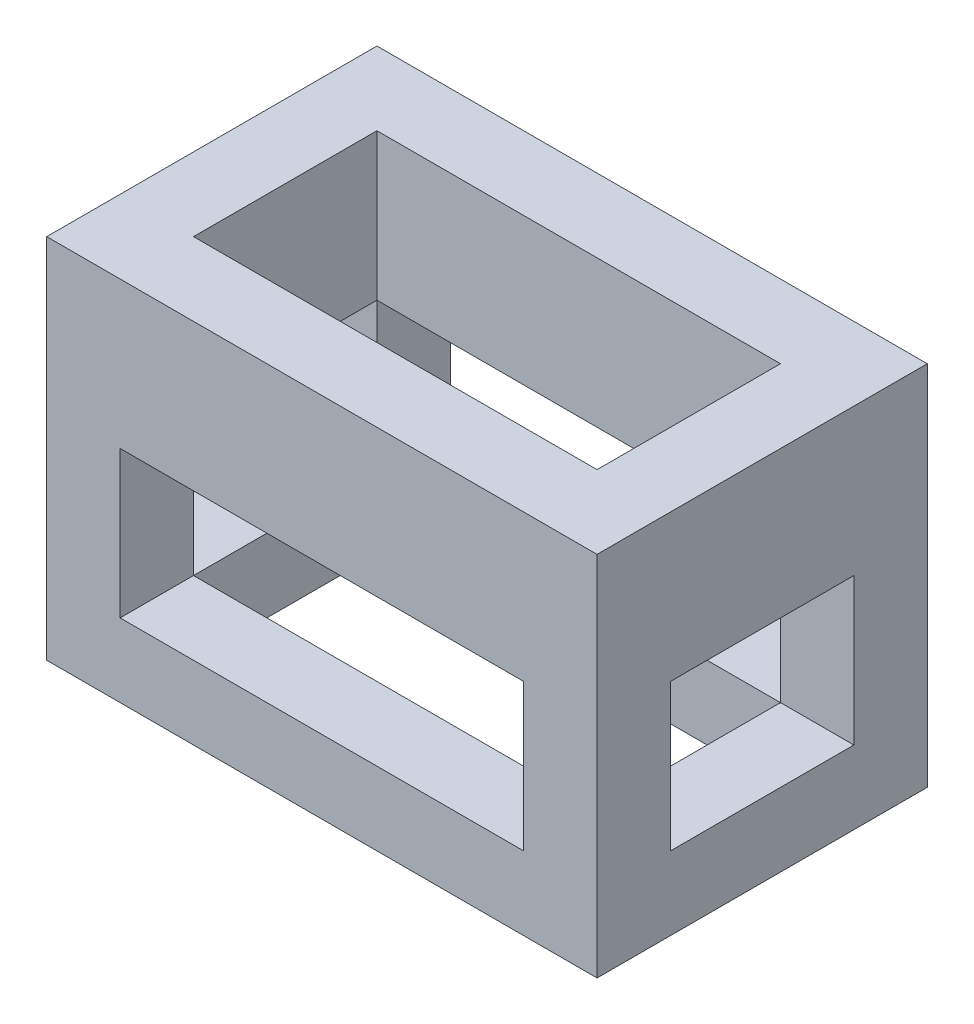
ISO-10303-21;
HEADER;
FILE_DESCRIPTION(('STEP AP214'),'2;1');
FILE_NAME('part.step','',(''),(''),'','','');
FILE_SCHEMA(('AUTOMOTIVE_DESIGN { 1 0 10303 214 1 1 1 1 }'));
ENDSEC;
DATA;
#1=APPLICATION_CONTEXT('core data for automotive mechanical design processes');
#2=APPLICATION_PROTOCOL_DEFINITION('international standard','automotive_design',2000,#1);
#3=PRODUCT_CONTEXT('',#1,'mechanical');
#4=PRODUCT('Part','Part','',(#3));
#5=PRODUCT_RELATED_PRODUCT_CATEGORY('part','',(#4));
#6=PRODUCT_DEFINITION_FORMATION('','',#4);
#7=PRODUCT_DEFINITION_CONTEXT('part definition',#1,'design');
#8=PRODUCT_DEFINITION('design','',#6,#7);
#9=PRODUCT_DEFINITION_SHAPE('','',#8);
#10=(LENGTH_UNIT() NAMED_UNIT(*) SI_UNIT(.MILLI.,.METRE.));
#11=(NAMED_UNIT(*) PLANE_ANGLE_UNIT() SI_UNIT($,.RADIAN.));
#12=(NAMED_UNIT(*) SI_UNIT($,.STERADIAN.) SOLID_ANGLE_UNIT());
#13=UNCERTAINTY_MEASURE_WITH_UNIT(LENGTH_MEASURE(1.E-05),#10,'distance_accuracy_value','');
#14=(GEOMETRIC_REPRESENTATION_CONTEXT(3) GLOBAL_UNCERTAINTY_ASSIGNED_CONTEXT((#13)) GLOBAL_UNIT_ASSIGNED_CONTEXT((#10,
#11,#12)) REPRESENTATION_CONTEXT('',''));
#15=CARTESIAN_POINT('',(0.,0.,0.));
#16=DIRECTION('',(0.,0.,1.));
#17=DIRECTION('',(1.,0.,0.));
#18=AXIS2_PLACEMENT_3D('',#15,#16,#17);
#19=CARTESIAN_POINT('',(69.85,76.2,-57.15));
#20=DIRECTION('',(0.,1.,0.));
#21=DIRECTION('',(-1.,0.,0.));
#22=AXIS2_PLACEMENT_3D('',#19,#20,#21);
#23=PLANE('',#22);
#24=DIRECTION('',(1.,0.,0.));
#25=VECTOR('',#24,1.);
#26=CARTESIAN_POINT('',(-95.25,76.2,-31.75));
#27=LINE('',#26,#25);
#28=CARTESIAN_POINT('',(-95.25,76.2,-31.75));
#29=VERTEX_POINT('',#28);
#30=CARTESIAN_POINT('',(-69.85,76.2,-31.75));
#31=VERTEX_POINT('',#30);
#32=EDGE_CURVE('E265',#29,#31,#27,.T.);
#33=ORIENTED_EDGE('',*,*,#32,.T.);
#34=DIRECTION('',(0.,0.,1.));
#35=VECTOR('',#34,1.);
#36=CARTESIAN_POINT('',(-69.85,76.2,-57.15));
#37=LINE('',#36,#35);
#38=CARTESIAN_POINT('',(-69.85,76.2,31.75));
#39=VERTEX_POINT('',#38);
#40=EDGE_CURVE('E221',#31,#39,#37,.T.);
#41=ORIENTED_EDGE('',*,*,#40,.T.);
#42=DIRECTION('',(1.,0.,0.));
#43=VECTOR('',#42,1.);
#44=CARTESIAN_POINT('',(-95.25,76.2,31.75));
#45=LINE('',#44,#43);
#46=CARTESIAN_POINT('',(-95.25,76.2,31.75));
#47=VERTEX_POINT('',#46);
#48=EDGE_CURVE('E260',#47,#39,#45,.T.);
#49=ORIENTED_EDGE('',*,*,#48,.F.);
#50=DIRECTION('',(0.,0.,1.));
#51=VECTOR('',#50,1.);
#52=CARTESIAN_POINT('',(-95.25,76.2,-31.75));
#53=LINE('',#52,#51);
#54=EDGE_CURVE('E247',#29,#47,#53,.T.);
#55=ORIENTED_EDGE('',*,*,#54,.F.);
#56=EDGE_LOOP('',(#33,#41,#49,#55));
#57=FACE_BOUND('',#56,.T.);
#58=ADVANCED_FACE('F35',(#57),#23,.F.);
#59=DIRECTION('',(0.,0.,1.));
#60=VECTOR('',#59,1.);
#61=CARTESIAN_POINT('',(69.85,76.2,-57.15));
#62=LINE('',#61,#60);
#63=CARTESIAN_POINT('',(69.85,76.2,-57.15));
#64=VERTEX_POINT('',#63);
#65=CARTESIAN_POINT('',(69.85,76.2,-31.75));
#66=VERTEX_POINT('',#65);
#67=EDGE_CURVE('E317',#64,#66,#62,.T.);
#68=ORIENTED_EDGE('',*,*,#67,.T.);
#69=DIRECTION('',(-1.,0.,0.));
#70=VECTOR('',#69,1.);
#71=CARTESIAN_POINT('',(69.85,76.2,-31.75));
#72=LINE('',#71,#70);
#73=EDGE_CURVE('E233',#66,#31,#72,.T.);
#74=ORIENTED_EDGE('',*,*,#73,.T.);
#75=DIRECTION('',(0.,0.,1.));
#76=VECTOR('',#75,1.);
#77=CARTESIAN_POINT('',(-69.85,76.2,-57.15));
#78=LINE('',#77,#76);
#79=CARTESIAN_POINT('',(-69.85,76.2,-57.15));
#80=VERTEX_POINT('',#79);
#81=EDGE_CURVE('E312',#80,#31,#78,.T.);
#82=ORIENTED_EDGE('',*,*,#81,.F.);
#83=DIRECTION('',(-1.,0.,0.));
#84=VECTOR('',#83,1.);
#85=CARTESIAN_POINT('',(69.85,76.2,-57.15));
#86=LINE('',#85,#84);
#87=EDGE_CURVE('E298',#64,#80,#86,.T.);
#88=ORIENTED_EDGE('',*,*,#87,.F.);
#89=EDGE_LOOP('',(#68,#74,#82,#88));
#90=FACE_BOUND('',#89,.T.);
#91=ADVANCED_FACE('F441',(#90),#23,.F.);
#92=CARTESIAN_POINT('',(69.85,76.2,31.75));
#93=VERTEX_POINT('',#92);
#94=CARTESIAN_POINT('',(95.25,76.2,31.75));
#95=VERTEX_POINT('',#94);
#96=EDGE_CURVE('E264',#93,#95,#45,.T.);
#97=ORIENTED_EDGE('',*,*,#96,.F.);
#98=DIRECTION('',(0.,0.,-1.));
#99=VECTOR('',#98,1.);
#100=CARTESIAN_POINT('',(69.85,76.2,-57.15));
#101=LINE('',#100,#99);
#102=EDGE_CURVE('E227',#93,#66,#101,.T.);
#103=ORIENTED_EDGE('',*,*,#102,.T.);
#104=CARTESIAN_POINT('',(95.25,76.2,-31.75));
#105=VERTEX_POINT('',#104);
#106=EDGE_CURVE('E268',#66,#105,#27,.T.);
#107=ORIENTED_EDGE('',*,*,#106,.T.);
#108=DIRECTION('',(0.,0.,1.));
#109=VECTOR('',#108,1.);
#110=CARTESIAN_POINT('',(95.25,76.2,-31.75));
#111=LINE('',#110,#109);
#112=EDGE_CURVE('E241',#105,#95,#111,.T.);
#113=ORIENTED_EDGE('',*,*,#112,.T.);
#114=EDGE_LOOP('',(#97,#103,#107,#113));
#115=FACE_BOUND('',#114,.T.);
#116=ADVANCED_FACE('F388',(#115),#23,.F.);
#117=CARTESIAN_POINT('',(69.85,25.4,-57.15));
#118=DIRECTION('',(0.,-1.,0.));
#119=DIRECTION('',(1.,0.,0.));
#120=AXIS2_PLACEMENT_3D('',#117,#118,#119);
#121=PLANE('',#120);
#122=DIRECTION('',(1.,0.,0.));
#123=VECTOR('',#122,1.);
#124=CARTESIAN_POINT('',(-95.25,25.4,31.75));
#125=LINE('',#124,#123);
#126=CARTESIAN_POINT('',(-95.25,25.4,31.75));
#127=VERTEX_POINT('',#126);
#128=CARTESIAN_POINT('',(-69.85,25.4,31.75));
#129=VERTEX_POINT('',#128);
#130=EDGE_CURVE('E273',#127,#129,#125,.T.);
#131=ORIENTED_EDGE('',*,*,#130,.T.);
#132=DIRECTION('',(0.,0.,-1.));
#133=VECTOR('',#132,1.);
#134=CARTESIAN_POINT('',(-69.85,25.4,-57.15));
#135=LINE('',#134,#133);
#136=CARTESIAN_POINT('',(-69.85,25.4,-31.75));
#137=VERTEX_POINT('',#136);
#138=EDGE_CURVE('E182',#129,#137,#135,.T.);
#139=ORIENTED_EDGE('',*,*,#138,.T.);
#140=DIRECTION('',(1.,0.,0.));
#141=VECTOR('',#140,1.);
#142=CARTESIAN_POINT('',(-95.25,25.4,-31.75));
#143=LINE('',#142,#141);
#144=CARTESIAN_POINT('',(-95.25,25.4,-31.75));
#145=VERTEX_POINT('',#144);
#146=EDGE_CURVE('E269',#145,#137,#143,.T.);
#147=ORIENTED_EDGE('',*,*,#146,.F.);
#148=DIRECTION('',(0.,0.,-1.));
#149=VECTOR('',#148,1.);
#150=CARTESIAN_POINT('',(-95.25,25.4,-31.75));
#151=LINE('',#150,#149);
#152=EDGE_CURVE('E240',#127,#145,#151,.T.);
#153=ORIENTED_EDGE('',*,*,#152,.F.);
#154=EDGE_LOOP('',(#131,#139,#147,#153));
#155=FACE_BOUND('',#154,.T.);
#156=ADVANCED_FACE('F363',(#155),#121,.F.);
#157=DIRECTION('',(0.,0.,1.));
#158=VECTOR('',#157,1.);
#159=CARTESIAN_POINT('',(-69.85,25.4,-57.15));
#160=LINE('',#159,#158);
#161=CARTESIAN_POINT('',(-69.85,25.4,-57.15));
#162=VERTEX_POINT('',#161);
#163=EDGE_CURVE('E325',#162,#137,#160,.T.);
#164=ORIENTED_EDGE('',*,*,#163,.T.);
#165=DIRECTION('',(1.,0.,0.));
#166=VECTOR('',#165,1.);
#167=CARTESIAN_POINT('',(69.85,25.4,-31.75));
#168=LINE('',#167,#166);
#169=CARTESIAN_POINT('',(69.85,25.4,-31.75));
#170=VERTEX_POINT('',#169);
#171=EDGE_CURVE('E11',#137,#170,#168,.T.);
#172=ORIENTED_EDGE('',*,*,#171,.T.);
#173=DIRECTION('',(0.,0.,1.));
#174=VECTOR('',#173,1.);
#175=CARTESIAN_POINT('',(69.85,25.4,-57.15));
#176=LINE('',#175,#174);
#177=CARTESIAN_POINT('',(69.85,25.4,-57.15));
#178=VERTEX_POINT('',#177);
#179=EDGE_CURVE('E321',#178,#170,#176,.T.);
#180=ORIENTED_EDGE('',*,*,#179,.F.);
#181=DIRECTION('',(1.,0.,0.));
#182=VECTOR('',#181,1.);
#183=CARTESIAN_POINT('',(69.85,25.4,-57.15));
#184=LINE('',#183,#182);
#185=EDGE_CURVE('E291',#162,#178,#184,.T.);
#186=ORIENTED_EDGE('',*,*,#185,.F.);
#187=EDGE_LOOP('',(#164,#172,#180,#186));
#188=FACE_BOUND('',#187,.T.);
#189=ADVANCED_FACE('F406',(#188),#121,.F.);
#190=CARTESIAN_POINT('',(95.25,25.4,-31.75));
#191=VERTEX_POINT('',#190);
#192=EDGE_CURVE('E272',#170,#191,#143,.T.);
#193=ORIENTED_EDGE('',*,*,#192,.F.);
#194=DIRECTION('',(0.,0.,1.));
#195=VECTOR('',#194,1.);
#196=CARTESIAN_POINT('',(69.85,25.4,-57.15));
#197=LINE('',#196,#195);
#198=CARTESIAN_POINT('',(69.85,25.4,31.75));
#199=VERTEX_POINT('',#198);
#200=EDGE_CURVE('E224',#170,#199,#197,.T.);
#201=ORIENTED_EDGE('',*,*,#200,.T.);
#202=CARTESIAN_POINT('',(95.25,25.4,31.75));
#203=VERTEX_POINT('',#202);
#204=EDGE_CURVE('E250',#199,#203,#125,.T.);
#205=ORIENTED_EDGE('',*,*,#204,.T.);
#206=DIRECTION('',(0.,0.,-1.));
#207=VECTOR('',#206,1.);
#208=CARTESIAN_POINT('',(95.25,25.4,-31.75));
#209=LINE('',#208,#207);
#210=EDGE_CURVE('E252',#203,#191,#209,.T.);
#211=ORIENTED_EDGE('',*,*,#210,.T.);
#212=EDGE_LOOP('',(#193,#201,#205,#211));
#213=FACE_BOUND('',#212,.T.);
#214=ADVANCED_FACE('F399',(#213),#121,.F.);
#215=CARTESIAN_POINT('',(-69.85,25.4,-57.15));
#216=DIRECTION('',(-1.,0.,0.));
#217=DIRECTION('',(0.,0.,1.));
#218=AXIS2_PLACEMENT_3D('',#215,#216,#217);
#219=PLANE('',#218);
#220=CARTESIAN_POINT('',(-69.85,25.4,57.15));
#221=VERTEX_POINT('',#220);
#222=EDGE_CURVE('E301',#129,#221,#160,.T.);
#223=ORIENTED_EDGE('',*,*,#222,.F.);
#224=DIRECTION('',(0.,1.,0.));
#225=VECTOR('',#224,1.);
#226=CARTESIAN_POINT('',(-69.85,25.4,31.75));
#227=LINE('',#226,#225);
#228=EDGE_CURVE('E284',#129,#39,#227,.T.);
#229=ORIENTED_EDGE('',*,*,#228,.T.);
#230=CARTESIAN_POINT('',(-69.85,76.2,57.15));
#231=VERTEX_POINT('',#230);
#232=EDGE_CURVE('E316',#39,#231,#78,.T.);
#233=ORIENTED_EDGE('',*,*,#232,.T.);
#234=DIRECTION('',(0.,-1.,0.));
#235=VECTOR('',#234,1.);
#236=CARTESIAN_POINT('',(-69.85,25.4,57.15));
#237=LINE('',#236,#235);
#238=EDGE_CURVE('E287',#231,#221,#237,.T.);
#239=ORIENTED_EDGE('',*,*,#238,.T.);
#240=EDGE_LOOP('',(#223,#229,#233,#239));
#241=FACE_BOUND('',#240,.T.);
#242=ADVANCED_FACE('F370',(#241),#219,.F.);
#243=CARTESIAN_POINT('',(69.85,25.4,-57.15));
#244=DIRECTION('',(1.,0.,0.));
#245=DIRECTION('',(0.,0.,-1.));
#246=AXIS2_PLACEMENT_3D('',#243,#244,#245);
#247=PLANE('',#246);
#248=CARTESIAN_POINT('',(69.85,76.2,57.15));
#249=VERTEX_POINT('',#248);
#250=EDGE_CURVE('E320',#93,#249,#62,.T.);
#251=ORIENTED_EDGE('',*,*,#250,.F.);
#252=DIRECTION('',(0.,-1.,0.));
#253=VECTOR('',#252,1.);
#254=CARTESIAN_POINT('',(69.85,25.4,31.75));
#255=LINE('',#254,#253);
#256=EDGE_CURVE('E281',#93,#199,#255,.T.);
#257=ORIENTED_EDGE('',*,*,#256,.T.);
#258=CARTESIAN_POINT('',(69.85,25.4,57.15));
#259=VERTEX_POINT('',#258);
#260=EDGE_CURVE('E324',#199,#259,#176,.T.);
#261=ORIENTED_EDGE('',*,*,#260,.T.);
#262=DIRECTION('',(0.,1.,0.));
#263=VECTOR('',#262,1.);
#264=CARTESIAN_POINT('',(69.85,25.4,57.15));
#265=LINE('',#264,#263);
#266=EDGE_CURVE('E307',#259,#249,#265,.T.);
#267=ORIENTED_EDGE('',*,*,#266,.T.);
#268=EDGE_LOOP('',(#251,#257,#261,#267));
#269=FACE_BOUND('',#268,.T.);
#270=ADVANCED_FACE('F380',(#269),#247,.F.);
#271=CARTESIAN_POINT('',(95.25,127.,57.15));
#272=DIRECTION('',(-1.,0.,0.));
#273=DIRECTION('',(0.,0.,1.));
#274=AXIS2_PLACEMENT_3D('',#271,#272,#273);
#275=PLANE('',#274);
#276=ORIENTED_EDGE('',*,*,#210,.F.);
#277=DIRECTION('',(0.,-1.,0.));
#278=VECTOR('',#277,1.);
#279=CARTESIAN_POINT('',(95.25,25.4,31.75));
#280=LINE('',#279,#278);
#281=EDGE_CURVE('E236',#95,#203,#280,.T.);
#282=ORIENTED_EDGE('',*,*,#281,.F.);
#283=ORIENTED_EDGE('',*,*,#112,.F.);
#284=DIRECTION('',(0.,1.,0.));
#285=VECTOR('',#284,1.);
#286=CARTESIAN_POINT('',(95.25,25.4,-31.75));
#287=LINE('',#286,#285);
#288=EDGE_CURVE('E255',#191,#105,#287,.T.);
#289=ORIENTED_EDGE('',*,*,#288,.F.);
#290=EDGE_LOOP('',(#276,#282,#283,#289));
#291=FACE_BOUND('',#290,.T.);
#292=DIRECTION('',(0.,0.,-1.));
#293=VECTOR('',#292,1.);
#294=CARTESIAN_POINT('',(95.25,0.,57.15));
#295=LINE('',#294,#293);
#296=CARTESIAN_POINT('',(95.25,0.,57.15));
#297=VERTEX_POINT('',#296);
#298=CARTESIAN_POINT('',(95.25,0.,-57.15));
#299=VERTEX_POINT('',#298);
#300=EDGE_CURVE('E315',#297,#299,#295,.T.);
#301=ORIENTED_EDGE('',*,*,#300,.T.);
#302=DIRECTION('',(0.,-1.,0.));
#303=VECTOR('',#302,1.);
#304=CARTESIAN_POINT('',(95.25,127.,-57.15));
#305=LINE('',#304,#303);
#306=CARTESIAN_POINT('',(95.25,127.,-57.15));
#307=VERTEX_POINT('',#306);
#308=EDGE_CURVE('E354',#307,#299,#305,.T.);
#309=ORIENTED_EDGE('',*,*,#308,.F.);
#310=DIRECTION('',(0.,0.,-1.));
#311=VECTOR('',#310,1.);
#312=CARTESIAN_POINT('',(95.25,127.,57.15));
#313=LINE('',#312,#311);
#314=CARTESIAN_POINT('',(95.25,127.,57.15));
#315=VERTEX_POINT('',#314);
#316=EDGE_CURVE('E328',#315,#307,#313,.T.);
#317=ORIENTED_EDGE('',*,*,#316,.F.);
#318=DIRECTION('',(0.,-1.,0.));
#319=VECTOR('',#318,1.);
#320=CARTESIAN_POINT('',(95.25,127.,57.15));
#321=LINE('',#320,#319);
#322=EDGE_CURVE('E338',#315,#297,#321,.T.);
#323=ORIENTED_EDGE('',*,*,#322,.T.);
#324=EDGE_LOOP('',(#301,#309,#317,#323));
#325=FACE_BOUND('',#324,.T.);
#326=ADVANCED_FACE('F37',(#291,#325),#275,.F.);
#327=CARTESIAN_POINT('',(-95.25,127.,-57.15));
#328=DIRECTION('',(0.,0.,1.));
#329=DIRECTION('',(1.,0.,0.));
#330=AXIS2_PLACEMENT_3D('',#327,#328,#329);
#331=PLANE('',#330);
#332=ORIENTED_EDGE('',*,*,#87,.T.);
#333=DIRECTION('',(0.,-1.,0.));
#334=VECTOR('',#333,1.);
#335=CARTESIAN_POINT('',(-69.85,25.4,-57.15));
#336=LINE('',#335,#334);
#337=EDGE_CURVE('E288',#80,#162,#336,.T.);
#338=ORIENTED_EDGE('',*,*,#337,.T.);
#339=ORIENTED_EDGE('',*,*,#185,.T.);
#340=DIRECTION('',(0.,1.,0.));
#341=VECTOR('',#340,1.);
#342=CARTESIAN_POINT('',(69.85,25.4,-57.15));
#343=LINE('',#342,#341);
#344=EDGE_CURVE('E295',#178,#64,#343,.T.);
#345=ORIENTED_EDGE('',*,*,#344,.T.);
#346=EDGE_LOOP('',(#332,#338,#339,#345));
#347=FACE_BOUND('',#346,.T.);
#348=DIRECTION('',(-1.,0.,0.));
#349=VECTOR('',#348,1.);
#350=CARTESIAN_POINT('',(-95.25,0.,-57.15));
#351=LINE('',#350,#349);
#352=CARTESIAN_POINT('',(-95.25,0.,-57.15));
#353=VERTEX_POINT('',#352);
#354=EDGE_CURVE('E341',#299,#353,#351,.T.);
#355=ORIENTED_EDGE('',*,*,#354,.T.);
#356=DIRECTION('',(0.,-1.,0.));
#357=VECTOR('',#356,1.);
#358=CARTESIAN_POINT('',(-95.25,127.,-57.15));
#359=LINE('',#358,#357);
#360=CARTESIAN_POINT('',(-95.25,127.,-57.15));
#361=VERTEX_POINT('',#360);
#362=EDGE_CURVE('E351',#361,#353,#359,.T.);
#363=ORIENTED_EDGE('',*,*,#362,.F.);
#364=DIRECTION('',(-1.,0.,0.));
#365=VECTOR('',#364,1.);
#366=CARTESIAN_POINT('',(-95.25,127.,-57.15));
#367=LINE('',#366,#365);
#368=EDGE_CURVE('E331',#307,#361,#367,.T.);
#369=ORIENTED_EDGE('',*,*,#368,.F.);
#370=ORIENTED_EDGE('',*,*,#308,.T.);
#371=EDGE_LOOP('',(#355,#363,#369,#370));
#372=FACE_BOUND('',#371,.T.);
#373=ADVANCED_FACE('F420',(#347,#372),#331,.F.);
#374=CARTESIAN_POINT('',(-95.25,127.,57.15));
#375=DIRECTION('',(1.,0.,0.));
#376=DIRECTION('',(0.,0.,-1.));
#377=AXIS2_PLACEMENT_3D('',#374,#375,#376);
#378=PLANE('',#377);
#379=ORIENTED_EDGE('',*,*,#54,.T.);
#380=DIRECTION('',(0.,-1.,0.));
#381=VECTOR('',#380,1.);
#382=CARTESIAN_POINT('',(-95.25,25.4,31.75));
#383=LINE('',#382,#381);
#384=EDGE_CURVE('E237',#47,#127,#383,.T.);
#385=ORIENTED_EDGE('',*,*,#384,.T.);
#386=ORIENTED_EDGE('',*,*,#152,.T.);
#387=DIRECTION('',(0.,1.,0.));
#388=VECTOR('',#387,1.);
#389=CARTESIAN_POINT('',(-95.25,25.4,-31.75));
#390=LINE('',#389,#388);
#391=EDGE_CURVE('E244',#145,#29,#390,.T.);
#392=ORIENTED_EDGE('',*,*,#391,.T.);
#393=EDGE_LOOP('',(#379,#385,#386,#392));
#394=FACE_BOUND('',#393,.T.);
#395=DIRECTION('',(0.,0.,1.));
#396=VECTOR('',#395,1.);
#397=CARTESIAN_POINT('',(-95.25,0.,57.15));
#398=LINE('',#397,#396);
#399=CARTESIAN_POINT('',(-95.25,0.,57.15));
#400=VERTEX_POINT('',#399);
#401=EDGE_CURVE('E343',#353,#400,#398,.T.);
#402=ORIENTED_EDGE('',*,*,#401,.T.);
#403=DIRECTION('',(0.,-1.,0.));
#404=VECTOR('',#403,1.);
#405=CARTESIAN_POINT('',(-95.25,127.,57.15));
#406=LINE('',#405,#404);
#407=CARTESIAN_POINT('',(-95.25,127.,57.15));
#408=VERTEX_POINT('',#407);
#409=EDGE_CURVE('E348',#408,#400,#406,.T.);
#410=ORIENTED_EDGE('',*,*,#409,.F.);
#411=DIRECTION('',(0.,0.,1.));
#412=VECTOR('',#411,1.);
#413=CARTESIAN_POINT('',(-95.25,127.,57.15));
#414=LINE('',#413,#412);
#415=EDGE_CURVE('E334',#361,#408,#414,.T.);
#416=ORIENTED_EDGE('',*,*,#415,.F.);
#417=ORIENTED_EDGE('',*,*,#362,.T.);
#418=EDGE_LOOP('',(#402,#410,#416,#417));
#419=FACE_BOUND('',#418,.T.);
#420=ADVANCED_FACE('F417',(#394,#419),#378,.F.);
#421=CARTESIAN_POINT('',(-95.25,127.,57.15));
#422=DIRECTION('',(0.,0.,-1.));
#423=DIRECTION('',(-1.,0.,0.));
#424=AXIS2_PLACEMENT_3D('',#421,#422,#423);
#425=PLANE('',#424);
#426=DIRECTION('',(1.,0.,0.));
#427=VECTOR('',#426,1.);
#428=CARTESIAN_POINT('',(69.85,25.4,57.15));
#429=LINE('',#428,#427);
#430=EDGE_CURVE('E304',#221,#259,#429,.T.);
#431=ORIENTED_EDGE('',*,*,#430,.F.);
#432=ORIENTED_EDGE('',*,*,#238,.F.);
#433=DIRECTION('',(-1.,0.,0.));
#434=VECTOR('',#433,1.);
#435=CARTESIAN_POINT('',(69.85,76.2,57.15));
#436=LINE('',#435,#434);
#437=EDGE_CURVE('E292',#249,#231,#436,.T.);
#438=ORIENTED_EDGE('',*,*,#437,.F.);
#439=ORIENTED_EDGE('',*,*,#266,.F.);
#440=EDGE_LOOP('',(#431,#432,#438,#439));
#441=FACE_BOUND('',#440,.T.);
#442=DIRECTION('',(1.,0.,0.));
#443=VECTOR('',#442,1.);
#444=CARTESIAN_POINT('',(-95.25,0.,57.15));
#445=LINE('',#444,#443);
#446=EDGE_CURVE('E332',#400,#297,#445,.T.);
#447=ORIENTED_EDGE('',*,*,#446,.T.);
#448=ORIENTED_EDGE('',*,*,#322,.F.);
#449=DIRECTION('',(1.,0.,0.));
#450=VECTOR('',#449,1.);
#451=CARTESIAN_POINT('',(-95.25,127.,57.15));
#452=LINE('',#451,#450);
#453=EDGE_CURVE('E336',#408,#315,#452,.T.);
#454=ORIENTED_EDGE('',*,*,#453,.F.);
#455=ORIENTED_EDGE('',*,*,#409,.T.);
#456=EDGE_LOOP('',(#447,#448,#454,#455));
#457=FACE_BOUND('',#456,.T.);
#458=ADVANCED_FACE('F376',(#441,#457),#425,.F.);
#459=CARTESIAN_POINT('',(0.,127.,0.));
#460=DIRECTION('',(0.,-1.,0.));
#461=DIRECTION('',(0.,0.,-1.));
#462=AXIS2_PLACEMENT_3D('',#459,#460,#461);
#463=PLANE('',#462);
#464=DIRECTION('',(1.,0.,0.));
#465=VECTOR('',#464,1.);
#466=CARTESIAN_POINT('',(69.85,127.,31.75));
#467=LINE('',#466,#465);
#468=CARTESIAN_POINT('',(-69.85,127.,31.75));
#469=VERTEX_POINT('',#468);
#470=CARTESIAN_POINT('',(69.85,127.,31.75));
#471=VERTEX_POINT('',#470);
#472=EDGE_CURVE('E207',#469,#471,#467,.T.);
#473=ORIENTED_EDGE('',*,*,#472,.F.);
#474=DIRECTION('',(0.,0.,1.));
#475=VECTOR('',#474,1.);
#476=CARTESIAN_POINT('',(-69.85,127.,-31.75));
#477=LINE('',#476,#475);
#478=CARTESIAN_POINT('',(-69.85,127.,-31.75));
#479=VERTEX_POINT('',#478);
#480=EDGE_CURVE('E50',#479,#469,#477,.T.);
#481=ORIENTED_EDGE('',*,*,#480,.F.);
#482=DIRECTION('',(-1.,0.,0.));
#483=VECTOR('',#482,1.);
#484=CARTESIAN_POINT('',(69.85,127.,-31.75));
#485=LINE('',#484,#483);
#486=CARTESIAN_POINT('',(69.85,127.,-31.75));
#487=VERTEX_POINT('',#486);
#488=EDGE_CURVE('E198',#487,#479,#485,.T.);
#489=ORIENTED_EDGE('',*,*,#488,.F.);
#490=DIRECTION('',(0.,0.,-1.));
#491=VECTOR('',#490,1.);
#492=CARTESIAN_POINT('',(69.85,127.,-31.75));
#493=LINE('',#492,#491);
#494=EDGE_CURVE('E201',#471,#487,#493,.T.);
#495=ORIENTED_EDGE('',*,*,#494,.F.);
#496=EDGE_LOOP('',(#473,#481,#489,#495));
#497=FACE_BOUND('',#496,.T.);
#498=ORIENTED_EDGE('',*,*,#316,.T.);
#499=ORIENTED_EDGE('',*,*,#368,.T.);
#500=ORIENTED_EDGE('',*,*,#415,.T.);
#501=ORIENTED_EDGE('',*,*,#453,.T.);
#502=EDGE_LOOP('',(#498,#499,#500,#501));
#503=FACE_BOUND('',#502,.T.);
#504=ADVANCED_FACE('F433',(#497,#503),#463,.F.);
#505=CARTESIAN_POINT('',(0.,0.,0.));
#506=DIRECTION('',(0.,-1.,0.));
#507=DIRECTION('',(0.,0.,-1.));
#508=AXIS2_PLACEMENT_3D('',#505,#506,#507);
#509=PLANE('',#508);
#510=DIRECTION('',(0.,0.,1.));
#511=VECTOR('',#510,1.);
#512=CARTESIAN_POINT('',(-69.85,0.,-31.75));
#513=LINE('',#512,#511);
#514=CARTESIAN_POINT('',(-69.85,0.,-31.75));
#515=VERTEX_POINT('',#514);
#516=CARTESIAN_POINT('',(-69.85,0.,31.75));
#517=VERTEX_POINT('',#516);
#518=EDGE_CURVE('E179',#515,#517,#513,.T.);
#519=ORIENTED_EDGE('',*,*,#518,.T.);
#520=DIRECTION('',(1.,0.,0.));
#521=VECTOR('',#520,1.);
#522=CARTESIAN_POINT('',(69.85,0.,31.75));
#523=LINE('',#522,#521);
#524=CARTESIAN_POINT('',(69.85,0.,31.75));
#525=VERTEX_POINT('',#524);
#526=EDGE_CURVE('E189',#517,#525,#523,.T.);
#527=ORIENTED_EDGE('',*,*,#526,.T.);
#528=DIRECTION('',(0.,0.,-1.));
#529=VECTOR('',#528,1.);
#530=CARTESIAN_POINT('',(69.85,0.,-31.75));
#531=LINE('',#530,#529);
#532=CARTESIAN_POINT('',(69.85,0.,-31.75));
#533=VERTEX_POINT('',#532);
#534=EDGE_CURVE('E58',#525,#533,#531,.T.);
#535=ORIENTED_EDGE('',*,*,#534,.T.);
#536=DIRECTION('',(-1.,0.,0.));
#537=VECTOR('',#536,1.);
#538=CARTESIAN_POINT('',(69.85,0.,-31.75));
#539=LINE('',#538,#537);
#540=EDGE_CURVE('E197',#533,#515,#539,.T.);
#541=ORIENTED_EDGE('',*,*,#540,.T.);
#542=EDGE_LOOP('',(#519,#527,#535,#541));
#543=FACE_BOUND('',#542,.T.);
#544=ORIENTED_EDGE('',*,*,#300,.F.);
#545=ORIENTED_EDGE('',*,*,#446,.F.);
#546=ORIENTED_EDGE('',*,*,#401,.F.);
#547=ORIENTED_EDGE('',*,*,#354,.F.);
#548=EDGE_LOOP('',(#544,#545,#546,#547));
#549=FACE_BOUND('',#548,.T.);
#550=ADVANCED_FACE('F194',(#543,#549),#509,.T.);
#551=ORIENTED_EDGE('',*,*,#81,.T.);
#552=DIRECTION('',(0.,-1.,0.));
#553=VECTOR('',#552,1.);
#554=CARTESIAN_POINT('',(-69.85,25.4,-31.75));
#555=LINE('',#554,#553);
#556=EDGE_CURVE('E278',#31,#137,#555,.T.);
#557=ORIENTED_EDGE('',*,*,#556,.T.);
#558=ORIENTED_EDGE('',*,*,#163,.F.);
#559=ORIENTED_EDGE('',*,*,#337,.F.);
#560=EDGE_LOOP('',(#551,#557,#558,#559));
#561=FACE_BOUND('',#560,.T.);
#562=ADVANCED_FACE('F410',(#561),#219,.F.);
#563=ORIENTED_EDGE('',*,*,#232,.F.);
#564=DIRECTION('',(1.,0.,0.));
#565=VECTOR('',#564,1.);
#566=CARTESIAN_POINT('',(69.85,76.2,31.75));
#567=LINE('',#566,#565);
#568=EDGE_CURVE('E230',#39,#93,#567,.T.);
#569=ORIENTED_EDGE('',*,*,#568,.T.);
#570=ORIENTED_EDGE('',*,*,#250,.T.);
#571=ORIENTED_EDGE('',*,*,#437,.T.);
#572=EDGE_LOOP('',(#563,#569,#570,#571));
#573=FACE_BOUND('',#572,.T.);
#574=ADVANCED_FACE('F443',(#573),#23,.F.);
#575=ORIENTED_EDGE('',*,*,#179,.T.);
#576=DIRECTION('',(0.,1.,0.));
#577=VECTOR('',#576,1.);
#578=CARTESIAN_POINT('',(69.85,25.4,-31.75));
#579=LINE('',#578,#577);
#580=EDGE_CURVE('E263',#170,#66,#579,.T.);
#581=ORIENTED_EDGE('',*,*,#580,.T.);
#582=ORIENTED_EDGE('',*,*,#67,.F.);
#583=ORIENTED_EDGE('',*,*,#344,.F.);
#584=EDGE_LOOP('',(#575,#581,#582,#583));
#585=FACE_BOUND('',#584,.T.);
#586=ADVANCED_FACE('F451',(#585),#247,.F.);
#587=ORIENTED_EDGE('',*,*,#260,.F.);
#588=DIRECTION('',(-1.,0.,0.));
#589=VECTOR('',#588,1.);
#590=CARTESIAN_POINT('',(69.85,25.4,31.75));
#591=LINE('',#590,#589);
#592=EDGE_CURVE('E43',#199,#129,#591,.T.);
#593=ORIENTED_EDGE('',*,*,#592,.T.);
#594=ORIENTED_EDGE('',*,*,#222,.T.);
#595=ORIENTED_EDGE('',*,*,#430,.T.);
#596=EDGE_LOOP('',(#587,#593,#594,#595));
#597=FACE_BOUND('',#596,.T.);
#598=ADVANCED_FACE('F358',(#597),#121,.F.);
#599=CARTESIAN_POINT('',(-95.25,25.4,-31.75));
#600=DIRECTION('',(0.,0.,-1.));
#601=DIRECTION('',(-1.,0.,0.));
#602=AXIS2_PLACEMENT_3D('',#599,#600,#601);
#603=PLANE('',#602);
#604=ORIENTED_EDGE('',*,*,#192,.T.);
#605=ORIENTED_EDGE('',*,*,#288,.T.);
#606=ORIENTED_EDGE('',*,*,#106,.F.);
#607=ORIENTED_EDGE('',*,*,#580,.F.);
#608=EDGE_LOOP('',(#604,#605,#606,#607));
#609=FACE_BOUND('',#608,.T.);
#610=ADVANCED_FACE('F468',(#609),#603,.F.);
#611=CARTESIAN_POINT('',(-95.25,25.4,31.75));
#612=DIRECTION('',(0.,0.,1.));
#613=DIRECTION('',(1.,0.,0.));
#614=AXIS2_PLACEMENT_3D('',#611,#612,#613);
#615=PLANE('',#614);
#616=ORIENTED_EDGE('',*,*,#96,.T.);
#617=ORIENTED_EDGE('',*,*,#281,.T.);
#618=ORIENTED_EDGE('',*,*,#204,.F.);
#619=ORIENTED_EDGE('',*,*,#256,.F.);
#620=EDGE_LOOP('',(#616,#617,#618,#619));
#621=FACE_BOUND('',#620,.T.);
#622=ADVANCED_FACE('F385',(#621),#615,.F.);
#623=ORIENTED_EDGE('',*,*,#130,.F.);
#624=ORIENTED_EDGE('',*,*,#384,.F.);
#625=ORIENTED_EDGE('',*,*,#48,.T.);
#626=ORIENTED_EDGE('',*,*,#228,.F.);
#627=EDGE_LOOP('',(#623,#624,#625,#626));
#628=FACE_BOUND('',#627,.T.);
#629=ADVANCED_FACE('F367',(#628),#615,.F.);
#630=ORIENTED_EDGE('',*,*,#32,.F.);
#631=ORIENTED_EDGE('',*,*,#391,.F.);
#632=ORIENTED_EDGE('',*,*,#146,.T.);
#633=ORIENTED_EDGE('',*,*,#556,.F.);
#634=EDGE_LOOP('',(#630,#631,#632,#633));
#635=FACE_BOUND('',#634,.T.);
#636=ADVANCED_FACE('F413',(#635),#603,.F.);
#637=CARTESIAN_POINT('',(69.85,0.,31.75));
#638=DIRECTION('',(0.,0.,1.));
#639=DIRECTION('',(1.,0.,0.));
#640=AXIS2_PLACEMENT_3D('',#637,#638,#639);
#641=PLANE('',#640);
#642=DIRECTION('',(0.,1.,0.));
#643=VECTOR('',#642,1.);
#644=CARTESIAN_POINT('',(69.85,0.,31.75));
#645=LINE('',#644,#643);
#646=EDGE_CURVE('E191',#525,#199,#645,.T.);
#647=ORIENTED_EDGE('',*,*,#646,.F.);
#648=ORIENTED_EDGE('',*,*,#526,.F.);
#649=DIRECTION('',(0.,1.,0.));
#650=VECTOR('',#649,1.);
#651=CARTESIAN_POINT('',(-69.85,0.,31.75));
#652=LINE('',#651,#650);
#653=EDGE_CURVE('E174',#517,#129,#652,.T.);
#654=ORIENTED_EDGE('',*,*,#653,.T.);
#655=ORIENTED_EDGE('',*,*,#592,.F.);
#656=EDGE_LOOP('',(#647,#648,#654,#655));
#657=FACE_BOUND('',#656,.T.);
#658=ADVANCED_FACE('F190',(#657),#641,.F.);
#659=CARTESIAN_POINT('',(69.85,0.,-31.75));
#660=DIRECTION('',(1.,0.,0.));
#661=DIRECTION('',(0.,0.,-1.));
#662=AXIS2_PLACEMENT_3D('',#659,#660,#661);
#663=PLANE('',#662);
#664=DIRECTION('',(0.,1.,0.));
#665=VECTOR('',#664,1.);
#666=CARTESIAN_POINT('',(69.85,0.,-31.75));
#667=LINE('',#666,#665);
#668=EDGE_CURVE('E215',#533,#170,#667,.T.);
#669=ORIENTED_EDGE('',*,*,#668,.F.);
#670=ORIENTED_EDGE('',*,*,#534,.F.);
#671=ORIENTED_EDGE('',*,*,#646,.T.);
#672=ORIENTED_EDGE('',*,*,#200,.F.);
#673=EDGE_LOOP('',(#669,#670,#671,#672));
#674=FACE_BOUND('',#673,.T.);
#675=ADVANCED_FACE('F401',(#674),#663,.F.);
#676=CARTESIAN_POINT('',(69.85,0.,-31.75));
#677=DIRECTION('',(0.,0.,-1.));
#678=DIRECTION('',(-1.,0.,0.));
#679=AXIS2_PLACEMENT_3D('',#676,#677,#678);
#680=PLANE('',#679);
#681=DIRECTION('',(0.,1.,0.));
#682=VECTOR('',#681,1.);
#683=CARTESIAN_POINT('',(-69.85,0.,-31.75));
#684=LINE('',#683,#682);
#685=EDGE_CURVE('E212',#515,#137,#684,.T.);
#686=ORIENTED_EDGE('',*,*,#685,.F.);
#687=ORIENTED_EDGE('',*,*,#540,.F.);
#688=ORIENTED_EDGE('',*,*,#668,.T.);
#689=ORIENTED_EDGE('',*,*,#171,.F.);
#690=EDGE_LOOP('',(#686,#687,#688,#689));
#691=FACE_BOUND('',#690,.T.);
#692=ADVANCED_FACE('F403',(#691),#680,.F.);
#693=CARTESIAN_POINT('',(-69.85,0.,-31.75));
#694=DIRECTION('',(-1.,0.,0.));
#695=DIRECTION('',(0.,0.,1.));
#696=AXIS2_PLACEMENT_3D('',#693,#694,#695);
#697=PLANE('',#696);
#698=ORIENTED_EDGE('',*,*,#653,.F.);
#699=ORIENTED_EDGE('',*,*,#518,.F.);
#700=ORIENTED_EDGE('',*,*,#685,.T.);
#701=ORIENTED_EDGE('',*,*,#138,.F.);
#702=EDGE_LOOP('',(#698,#699,#700,#701));
#703=FACE_BOUND('',#702,.T.);
#704=ADVANCED_FACE('F176',(#703),#697,.F.);
#705=EDGE_CURVE('E218',#66,#487,#667,.T.);
#706=ORIENTED_EDGE('',*,*,#705,.T.);
#707=ORIENTED_EDGE('',*,*,#488,.T.);
#708=EDGE_CURVE('E214',#31,#479,#684,.T.);
#709=ORIENTED_EDGE('',*,*,#708,.F.);
#710=ORIENTED_EDGE('',*,*,#73,.F.);
#711=EDGE_LOOP('',(#706,#707,#709,#710));
#712=FACE_BOUND('',#711,.T.);
#713=ADVANCED_FACE('F580',(#712),#680,.F.);
#714=EDGE_CURVE('E186',#39,#469,#652,.T.);
#715=ORIENTED_EDGE('',*,*,#714,.T.);
#716=ORIENTED_EDGE('',*,*,#472,.T.);
#717=EDGE_CURVE('E185',#93,#471,#645,.T.);
#718=ORIENTED_EDGE('',*,*,#717,.F.);
#719=ORIENTED_EDGE('',*,*,#568,.F.);
#720=EDGE_LOOP('',(#715,#716,#718,#719));
#721=FACE_BOUND('',#720,.T.);
#722=ADVANCED_FACE('F561',(#721),#641,.F.);
#723=ORIENTED_EDGE('',*,*,#717,.T.);
#724=ORIENTED_EDGE('',*,*,#494,.T.);
#725=ORIENTED_EDGE('',*,*,#705,.F.);
#726=ORIENTED_EDGE('',*,*,#102,.F.);
#727=EDGE_LOOP('',(#723,#724,#725,#726));
#728=FACE_BOUND('',#727,.T.);
#729=ADVANCED_FACE('F571',(#728),#663,.F.);
#730=ORIENTED_EDGE('',*,*,#708,.T.);
#731=ORIENTED_EDGE('',*,*,#480,.T.);
#732=ORIENTED_EDGE('',*,*,#714,.F.);
#733=ORIENTED_EDGE('',*,*,#40,.F.);
#734=EDGE_LOOP('',(#730,#731,#732,#733));
#735=FACE_BOUND('',#734,.T.);
#736=ADVANCED_FACE('F589',(#735),#697,.F.);
#737=CLOSED_SHELL('',(#58,#91,#116,#156,#189,#214,#242,#270,#326,#373,#420,#458,#504,#550,#562,
#574,#586,#598,#610,#622,#629,#636,#658,#675,#692,#704,#713,#722,#729,#736));
#738=MANIFOLD_SOLID_BREP('B2',#737);
#739=ADVANCED_BREP_SHAPE_REPRESENTATION('',(#18,#738),#14);
#740=SHAPE_DEFINITION_REPRESENTATION(#9,#739);
ENDSEC;
END-ISO-10303-21;
